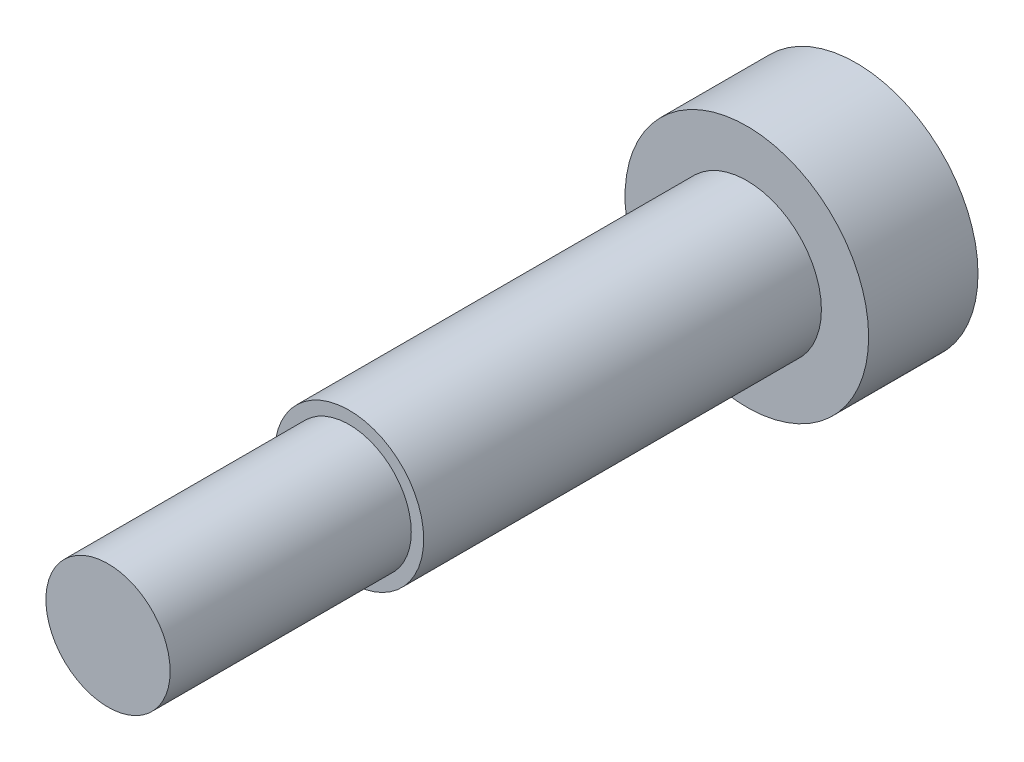
ISO-10303-21;
HEADER;
FILE_DESCRIPTION(('STEP AP214'),'2;1');
FILE_NAME('part.step','',(''),(''),'','','');
FILE_SCHEMA(('AUTOMOTIVE_DESIGN { 1 0 10303 214 1 1 1 1 }'));
ENDSEC;
DATA;
#1=APPLICATION_CONTEXT('core data for automotive mechanical design processes');
#2=APPLICATION_PROTOCOL_DEFINITION('international standard','automotive_design',2000,#1);
#3=PRODUCT_CONTEXT('',#1,'mechanical');
#4=PRODUCT('Part','Part','',(#3));
#5=PRODUCT_RELATED_PRODUCT_CATEGORY('part','',(#4));
#6=PRODUCT_DEFINITION_FORMATION('','',#4);
#7=PRODUCT_DEFINITION_CONTEXT('part definition',#1,'design');
#8=PRODUCT_DEFINITION('design','',#6,#7);
#9=PRODUCT_DEFINITION_SHAPE('','',#8);
#10=(LENGTH_UNIT() NAMED_UNIT(*) SI_UNIT(.MILLI.,.METRE.));
#11=(NAMED_UNIT(*) PLANE_ANGLE_UNIT() SI_UNIT($,.RADIAN.));
#12=(NAMED_UNIT(*) SI_UNIT($,.STERADIAN.) SOLID_ANGLE_UNIT());
#13=UNCERTAINTY_MEASURE_WITH_UNIT(LENGTH_MEASURE(1.E-05),#10,'distance_accuracy_value','');
#14=(GEOMETRIC_REPRESENTATION_CONTEXT(3) GLOBAL_UNCERTAINTY_ASSIGNED_CONTEXT((#13)) GLOBAL_UNIT_ASSIGNED_CONTEXT((#10,
#11,#12)) REPRESENTATION_CONTEXT('',''));
#15=CARTESIAN_POINT('',(0.,0.,0.));
#16=DIRECTION('',(0.,0.,1.));
#17=DIRECTION('',(1.,0.,0.));
#18=AXIS2_PLACEMENT_3D('',#15,#16,#17);
#19=CARTESIAN_POINT('',(0.,0.,4.4));
#20=DIRECTION('',(0.,0.,-1.));
#21=DIRECTION('',(-1.,0.,0.));
#22=AXIS2_PLACEMENT_3D('',#19,#20,#21);
#23=CYLINDRICAL_SURFACE('',#22,4.9);
#24=CARTESIAN_POINT('',(0.,0.,4.4));
#25=DIRECTION('',(0.,0.,1.));
#26=DIRECTION('',(1.,0.,0.));
#27=AXIS2_PLACEMENT_3D('',#24,#25,#26);
#28=CIRCLE('',#27,4.9);
#29=CARTESIAN_POINT('',(4.9,0.,4.4));
#30=VERTEX_POINT('',#29);
#31=EDGE_CURVE('E148',#30,#30,#28,.T.);
#32=ORIENTED_EDGE('',*,*,#31,.F.);
#33=EDGE_LOOP('',(#32));
#34=FACE_BOUND('',#33,.T.);
#35=CARTESIAN_POINT('',(0.,0.,0.));
#36=DIRECTION('',(0.,0.,1.));
#37=DIRECTION('',(1.,0.,0.));
#38=AXIS2_PLACEMENT_3D('',#35,#36,#37);
#39=CIRCLE('',#38,4.9);
#40=CARTESIAN_POINT('',(4.9,0.,0.));
#41=VERTEX_POINT('',#40);
#42=EDGE_CURVE('E36',#41,#41,#39,.T.);
#43=ORIENTED_EDGE('',*,*,#42,.T.);
#44=EDGE_LOOP('',(#43));
#45=FACE_BOUND('',#44,.T.);
#46=ADVANCED_FACE('F33',(#34,#45),#23,.T.);
#47=CARTESIAN_POINT('',(0.,0.,4.4));
#48=DIRECTION('',(0.,0.,1.));
#49=DIRECTION('',(1.,0.,0.));
#50=AXIS2_PLACEMENT_3D('',#47,#48,#49);
#51=PLANE('',#50);
#52=CARTESIAN_POINT('',(0.,0.,4.4));
#53=DIRECTION('',(0.,0.,1.));
#54=DIRECTION('',(1.,0.,0.));
#55=AXIS2_PLACEMENT_3D('',#52,#53,#54);
#56=CIRCLE('',#55,3.);
#57=CARTESIAN_POINT('',(3.,0.,4.4));
#58=VERTEX_POINT('',#57);
#59=EDGE_CURVE('E41',#58,#58,#56,.T.);
#60=ORIENTED_EDGE('',*,*,#59,.F.);
#61=EDGE_LOOP('',(#60));
#62=FACE_BOUND('',#61,.T.);
#63=ORIENTED_EDGE('',*,*,#31,.T.);
#64=EDGE_LOOP('',(#63));
#65=FACE_BOUND('',#64,.T.);
#66=ADVANCED_FACE('F159',(#62,#65),#51,.T.);
#67=CARTESIAN_POINT('',(0.,0.,0.));
#68=DIRECTION('',(0.,0.,1.));
#69=DIRECTION('',(1.,0.,0.));
#70=AXIS2_PLACEMENT_3D('',#67,#68,#69);
#71=PLANE('',#70);
#72=DIRECTION('',(0.866025403784439,-0.5,0.));
#73=VECTOR('',#72,1.);
#74=CARTESIAN_POINT('',(0.,1.73205080756888,0.));
#75=LINE('',#74,#73);
#76=CARTESIAN_POINT('',(0.,1.73205080756888,0.));
#77=VERTEX_POINT('',#76);
#78=CARTESIAN_POINT('',(1.5,0.866025403784438,0.));
#79=VERTEX_POINT('',#78);
#80=EDGE_CURVE('E123',#77,#79,#75,.T.);
#81=ORIENTED_EDGE('',*,*,#80,.F.);
#82=DIRECTION('',(0.866025403784439,0.5,0.));
#83=VECTOR('',#82,1.);
#84=CARTESIAN_POINT('',(-1.5,0.866025403784439,0.));
#85=LINE('',#84,#83);
#86=CARTESIAN_POINT('',(-1.5,0.866025403784439,0.));
#87=VERTEX_POINT('',#86);
#88=EDGE_CURVE('E49',#87,#77,#85,.T.);
#89=ORIENTED_EDGE('',*,*,#88,.F.);
#90=DIRECTION('',(0.,1.,0.));
#91=VECTOR('',#90,1.);
#92=CARTESIAN_POINT('',(-1.5,-0.866025403784441,0.));
#93=LINE('',#92,#91);
#94=CARTESIAN_POINT('',(-1.5,-0.866025403784441,0.));
#95=VERTEX_POINT('',#94);
#96=EDGE_CURVE('E132',#95,#87,#93,.T.);
#97=ORIENTED_EDGE('',*,*,#96,.F.);
#98=DIRECTION('',(-0.866025403784439,0.5,0.));
#99=VECTOR('',#98,1.);
#100=CARTESIAN_POINT('',(0.,-1.73205080756888,0.));
#101=LINE('',#100,#99);
#102=CARTESIAN_POINT('',(0.,-1.73205080756888,0.));
#103=VERTEX_POINT('',#102);
#104=EDGE_CURVE('E130',#103,#95,#101,.T.);
#105=ORIENTED_EDGE('',*,*,#104,.F.);
#106=DIRECTION('',(-0.866025403784438,-0.5,0.));
#107=VECTOR('',#106,1.);
#108=CARTESIAN_POINT('',(1.5,-0.86602540378444,0.));
#109=LINE('',#108,#107);
#110=CARTESIAN_POINT('',(1.5,-0.86602540378444,0.));
#111=VERTEX_POINT('',#110);
#112=EDGE_CURVE('E97',#111,#103,#109,.T.);
#113=ORIENTED_EDGE('',*,*,#112,.F.);
#114=DIRECTION('',(0.,-1.,0.));
#115=VECTOR('',#114,1.);
#116=CARTESIAN_POINT('',(1.5,0.866025403784438,0.));
#117=LINE('',#116,#115);
#118=EDGE_CURVE('E126',#79,#111,#117,.T.);
#119=ORIENTED_EDGE('',*,*,#118,.F.);
#120=EDGE_LOOP('',(#81,#89,#97,#105,#113,#119));
#121=FACE_BOUND('',#120,.T.);
#122=ORIENTED_EDGE('',*,*,#42,.F.);
#123=EDGE_LOOP('',(#122));
#124=FACE_BOUND('',#123,.T.);
#125=ADVANCED_FACE('F156',(#121,#124),#71,.F.);
#126=CARTESIAN_POINT('',(0.,0.,20.4));
#127=DIRECTION('',(0.,0.,-1.));
#128=DIRECTION('',(-1.,0.,0.));
#129=AXIS2_PLACEMENT_3D('',#126,#127,#128);
#130=CYLINDRICAL_SURFACE('',#129,3.);
#131=CARTESIAN_POINT('',(0.,0.,20.4));
#132=DIRECTION('',(0.,0.,1.));
#133=DIRECTION('',(1.,0.,0.));
#134=AXIS2_PLACEMENT_3D('',#131,#132,#133);
#135=CIRCLE('',#134,3.);
#136=CARTESIAN_POINT('',(3.,0.,20.4));
#137=VERTEX_POINT('',#136);
#138=EDGE_CURVE('E143',#137,#137,#135,.T.);
#139=ORIENTED_EDGE('',*,*,#138,.F.);
#140=EDGE_LOOP('',(#139));
#141=FACE_BOUND('',#140,.T.);
#142=ORIENTED_EDGE('',*,*,#59,.T.);
#143=EDGE_LOOP('',(#142));
#144=FACE_BOUND('',#143,.T.);
#145=ADVANCED_FACE('F158',(#141,#144),#130,.T.);
#146=CARTESIAN_POINT('',(0.,0.,20.4));
#147=DIRECTION('',(0.,0.,1.));
#148=DIRECTION('',(1.,0.,0.));
#149=AXIS2_PLACEMENT_3D('',#146,#147,#148);
#150=PLANE('',#149);
#151=CARTESIAN_POINT('',(0.,0.,20.4));
#152=DIRECTION('',(0.,0.,1.));
#153=DIRECTION('',(1.,0.,0.));
#154=AXIS2_PLACEMENT_3D('',#151,#152,#153);
#155=CIRCLE('',#154,2.5);
#156=CARTESIAN_POINT('',(2.5,0.,20.4));
#157=VERTEX_POINT('',#156);
#158=EDGE_CURVE('E11',#157,#157,#155,.T.);
#159=ORIENTED_EDGE('',*,*,#158,.F.);
#160=EDGE_LOOP('',(#159));
#161=FACE_BOUND('',#160,.T.);
#162=ORIENTED_EDGE('',*,*,#138,.T.);
#163=EDGE_LOOP('',(#162));
#164=FACE_BOUND('',#163,.T.);
#165=ADVANCED_FACE('F165',(#161,#164),#150,.T.);
#166=CARTESIAN_POINT('',(0.,0.,30.1));
#167=DIRECTION('',(0.,0.,-1.));
#168=DIRECTION('',(-1.,0.,0.));
#169=AXIS2_PLACEMENT_3D('',#166,#167,#168);
#170=CYLINDRICAL_SURFACE('',#169,2.5);
#171=CARTESIAN_POINT('',(0.,0.,30.1));
#172=DIRECTION('',(0.,0.,1.));
#173=DIRECTION('',(1.,0.,0.));
#174=AXIS2_PLACEMENT_3D('',#171,#172,#173);
#175=CIRCLE('',#174,2.5);
#176=CARTESIAN_POINT('',(2.5,0.,30.1));
#177=VERTEX_POINT('',#176);
#178=EDGE_CURVE('E136',#177,#177,#175,.T.);
#179=ORIENTED_EDGE('',*,*,#178,.F.);
#180=EDGE_LOOP('',(#179));
#181=FACE_BOUND('',#180,.T.);
#182=ORIENTED_EDGE('',*,*,#158,.T.);
#183=EDGE_LOOP('',(#182));
#184=FACE_BOUND('',#183,.T.);
#185=ADVANCED_FACE('F195',(#181,#184),#170,.T.);
#186=CARTESIAN_POINT('',(0.,0.,30.1));
#187=DIRECTION('',(0.,0.,1.));
#188=DIRECTION('',(1.,0.,0.));
#189=AXIS2_PLACEMENT_3D('',#186,#187,#188);
#190=PLANE('',#189);
#191=ORIENTED_EDGE('',*,*,#178,.T.);
#192=EDGE_LOOP('',(#191));
#193=FACE_BOUND('',#192,.T.);
#194=ADVANCED_FACE('F205',(#193),#190,.T.);
#195=CARTESIAN_POINT('',(-1.5,0.866025403784439,2.));
#196=DIRECTION('',(-0.5,0.866025403784439,0.));
#197=DIRECTION('',(-0.866025403784439,-0.5,0.));
#198=AXIS2_PLACEMENT_3D('',#195,#196,#197);
#199=PLANE('',#198);
#200=ORIENTED_EDGE('',*,*,#88,.T.);
#201=DIRECTION('',(0.,0.,-1.));
#202=VECTOR('',#201,1.);
#203=CARTESIAN_POINT('',(0.,1.73205080756888,2.));
#204=LINE('',#203,#202);
#205=CARTESIAN_POINT('',(0.,1.73205080756888,2.));
#206=VERTEX_POINT('',#205);
#207=EDGE_CURVE('E79',#206,#77,#204,.T.);
#208=ORIENTED_EDGE('',*,*,#207,.F.);
#209=DIRECTION('',(0.866025403784439,0.5,0.));
#210=VECTOR('',#209,1.);
#211=CARTESIAN_POINT('',(-1.5,0.866025403784439,2.));
#212=LINE('',#211,#210);
#213=CARTESIAN_POINT('',(-1.5,0.866025403784439,2.));
#214=VERTEX_POINT('',#213);
#215=EDGE_CURVE('E134',#214,#206,#212,.T.);
#216=ORIENTED_EDGE('',*,*,#215,.F.);
#217=DIRECTION('',(0.,0.,-1.));
#218=VECTOR('',#217,1.);
#219=CARTESIAN_POINT('',(-1.5,0.866025403784439,2.));
#220=LINE('',#219,#218);
#221=EDGE_CURVE('E57',#214,#87,#220,.T.);
#222=ORIENTED_EDGE('',*,*,#221,.T.);
#223=EDGE_LOOP('',(#200,#208,#216,#222));
#224=FACE_BOUND('',#223,.T.);
#225=ADVANCED_FACE('F214',(#224),#199,.F.);
#226=CARTESIAN_POINT('',(-1.5,-0.866025403784441,2.));
#227=DIRECTION('',(-1.,0.,0.));
#228=DIRECTION('',(0.,0.,1.));
#229=AXIS2_PLACEMENT_3D('',#226,#227,#228);
#230=PLANE('',#229);
#231=ORIENTED_EDGE('',*,*,#96,.T.);
#232=ORIENTED_EDGE('',*,*,#221,.F.);
#233=DIRECTION('',(0.,1.,0.));
#234=VECTOR('',#233,1.);
#235=CARTESIAN_POINT('',(-1.5,-0.866025403784441,2.));
#236=LINE('',#235,#234);
#237=CARTESIAN_POINT('',(-1.5,-0.866025403784441,2.));
#238=VERTEX_POINT('',#237);
#239=EDGE_CURVE('E109',#238,#214,#236,.T.);
#240=ORIENTED_EDGE('',*,*,#239,.F.);
#241=DIRECTION('',(0.,0.,-1.));
#242=VECTOR('',#241,1.);
#243=CARTESIAN_POINT('',(-1.5,-0.866025403784441,2.));
#244=LINE('',#243,#242);
#245=EDGE_CURVE('E101',#238,#95,#244,.T.);
#246=ORIENTED_EDGE('',*,*,#245,.T.);
#247=EDGE_LOOP('',(#231,#232,#240,#246));
#248=FACE_BOUND('',#247,.T.);
#249=ADVANCED_FACE('F228',(#248),#230,.F.);
#250=CARTESIAN_POINT('',(0.,-1.73205080756888,2.));
#251=DIRECTION('',(-0.5,-0.866025403784439,0.));
#252=DIRECTION('',(0.866025403784439,-0.5,0.));
#253=AXIS2_PLACEMENT_3D('',#250,#251,#252);
#254=PLANE('',#253);
#255=ORIENTED_EDGE('',*,*,#104,.T.);
#256=ORIENTED_EDGE('',*,*,#245,.F.);
#257=DIRECTION('',(-0.866025403784439,0.5,0.));
#258=VECTOR('',#257,1.);
#259=CARTESIAN_POINT('',(0.,-1.73205080756888,2.));
#260=LINE('',#259,#258);
#261=CARTESIAN_POINT('',(0.,-1.73205080756888,2.));
#262=VERTEX_POINT('',#261);
#263=EDGE_CURVE('E105',#262,#238,#260,.T.);
#264=ORIENTED_EDGE('',*,*,#263,.F.);
#265=DIRECTION('',(0.,0.,-1.));
#266=VECTOR('',#265,1.);
#267=CARTESIAN_POINT('',(0.,-1.73205080756888,2.));
#268=LINE('',#267,#266);
#269=EDGE_CURVE('E90',#262,#103,#268,.T.);
#270=ORIENTED_EDGE('',*,*,#269,.T.);
#271=EDGE_LOOP('',(#255,#256,#264,#270));
#272=FACE_BOUND('',#271,.T.);
#273=ADVANCED_FACE('F106',(#272),#254,.F.);
#274=CARTESIAN_POINT('',(1.5,-0.86602540378444,2.));
#275=DIRECTION('',(0.5,-0.866025403784438,0.));
#276=DIRECTION('',(0.866025403784439,0.5,0.));
#277=AXIS2_PLACEMENT_3D('',#274,#275,#276);
#278=PLANE('',#277);
#279=ORIENTED_EDGE('',*,*,#112,.T.);
#280=ORIENTED_EDGE('',*,*,#269,.F.);
#281=DIRECTION('',(-0.866025403784438,-0.5,0.));
#282=VECTOR('',#281,1.);
#283=CARTESIAN_POINT('',(1.5,-0.86602540378444,2.));
#284=LINE('',#283,#282);
#285=CARTESIAN_POINT('',(1.5,-0.86602540378444,2.));
#286=VERTEX_POINT('',#285);
#287=EDGE_CURVE('E94',#286,#262,#284,.T.);
#288=ORIENTED_EDGE('',*,*,#287,.F.);
#289=DIRECTION('',(0.,0.,-1.));
#290=VECTOR('',#289,1.);
#291=CARTESIAN_POINT('',(1.5,-0.86602540378444,2.));
#292=LINE('',#291,#290);
#293=EDGE_CURVE('E102',#286,#111,#292,.T.);
#294=ORIENTED_EDGE('',*,*,#293,.T.);
#295=EDGE_LOOP('',(#279,#280,#288,#294));
#296=FACE_BOUND('',#295,.T.);
#297=ADVANCED_FACE('F92',(#296),#278,.F.);
#298=CARTESIAN_POINT('',(1.5,0.866025403784438,2.));
#299=DIRECTION('',(1.,0.,0.));
#300=DIRECTION('',(0.,1.,0.));
#301=AXIS2_PLACEMENT_3D('',#298,#299,#300);
#302=PLANE('',#301);
#303=ORIENTED_EDGE('',*,*,#118,.T.);
#304=ORIENTED_EDGE('',*,*,#293,.F.);
#305=DIRECTION('',(0.,-1.,0.));
#306=VECTOR('',#305,1.);
#307=CARTESIAN_POINT('',(1.5,0.866025403784438,2.));
#308=LINE('',#307,#306);
#309=CARTESIAN_POINT('',(1.5,0.866025403784438,2.));
#310=VERTEX_POINT('',#309);
#311=EDGE_CURVE('E115',#310,#286,#308,.T.);
#312=ORIENTED_EDGE('',*,*,#311,.F.);
#313=DIRECTION('',(0.,0.,-1.));
#314=VECTOR('',#313,1.);
#315=CARTESIAN_POINT('',(1.5,0.866025403784438,2.));
#316=LINE('',#315,#314);
#317=EDGE_CURVE('E139',#310,#79,#316,.T.);
#318=ORIENTED_EDGE('',*,*,#317,.T.);
#319=EDGE_LOOP('',(#303,#304,#312,#318));
#320=FACE_BOUND('',#319,.T.);
#321=ADVANCED_FACE('F253',(#320),#302,.F.);
#322=CARTESIAN_POINT('',(0.,1.73205080756888,2.));
#323=DIRECTION('',(0.5,0.866025403784439,0.));
#324=DIRECTION('',(-0.866025403784439,0.5,0.));
#325=AXIS2_PLACEMENT_3D('',#322,#323,#324);
#326=PLANE('',#325);
#327=ORIENTED_EDGE('',*,*,#80,.T.);
#328=ORIENTED_EDGE('',*,*,#317,.F.);
#329=DIRECTION('',(0.866025403784439,-0.5,0.));
#330=VECTOR('',#329,1.);
#331=CARTESIAN_POINT('',(0.,1.73205080756888,2.));
#332=LINE('',#331,#330);
#333=EDGE_CURVE('E117',#206,#310,#332,.T.);
#334=ORIENTED_EDGE('',*,*,#333,.F.);
#335=ORIENTED_EDGE('',*,*,#207,.T.);
#336=EDGE_LOOP('',(#327,#328,#334,#335));
#337=FACE_BOUND('',#336,.T.);
#338=ADVANCED_FACE('F262',(#337),#326,.F.);
#339=CARTESIAN_POINT('',(0.,0.,2.));
#340=DIRECTION('',(0.,0.,-1.));
#341=DIRECTION('',(-1.,0.,0.));
#342=AXIS2_PLACEMENT_3D('',#339,#340,#341);
#343=PLANE('',#342);
#344=ORIENTED_EDGE('',*,*,#215,.T.);
#345=ORIENTED_EDGE('',*,*,#333,.T.);
#346=ORIENTED_EDGE('',*,*,#311,.T.);
#347=ORIENTED_EDGE('',*,*,#287,.T.);
#348=ORIENTED_EDGE('',*,*,#263,.T.);
#349=ORIENTED_EDGE('',*,*,#239,.T.);
#350=EDGE_LOOP('',(#344,#345,#346,#347,#348,#349));
#351=FACE_BOUND('',#350,.T.);
#352=ADVANCED_FACE('F112',(#351),#343,.T.);
#353=CLOSED_SHELL('',(#46,#66,#125,#145,#165,#185,#194,#225,#249,#273,#297,#321,#338,#352));
#354=MANIFOLD_SOLID_BREP('B2',#353);
#355=ADVANCED_BREP_SHAPE_REPRESENTATION('',(#18,#354),#14);
#356=SHAPE_DEFINITION_REPRESENTATION(#9,#355);
ENDSEC;
END-ISO-10303-21;
